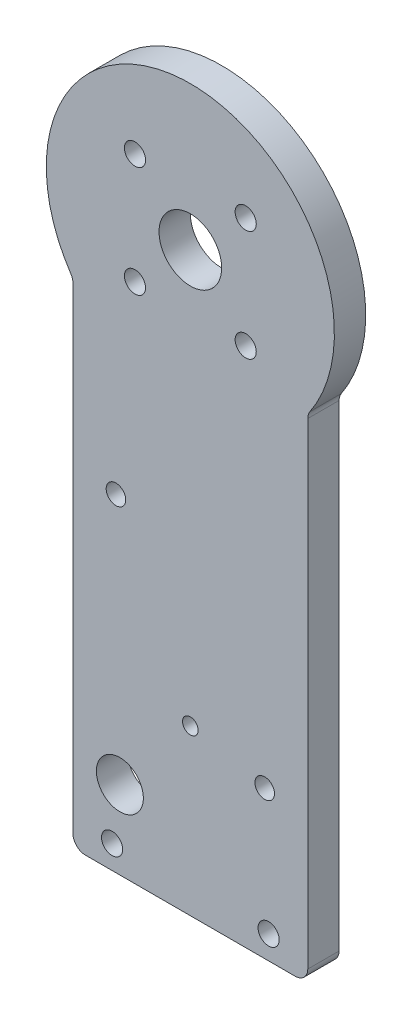
ISO-10303-21;
HEADER;
FILE_DESCRIPTION(('STEP AP214'),'2;1');
FILE_NAME('part.step','',(''),(''),'','','');
FILE_SCHEMA(('AUTOMOTIVE_DESIGN { 1 0 10303 214 1 1 1 1 }'));
ENDSEC;
DATA;
#1=APPLICATION_CONTEXT('core data for automotive mechanical design processes');
#2=APPLICATION_PROTOCOL_DEFINITION('international standard','automotive_design',2000,#1);
#3=PRODUCT_CONTEXT('',#1,'mechanical');
#4=PRODUCT('Part','Part','',(#3));
#5=PRODUCT_RELATED_PRODUCT_CATEGORY('part','',(#4));
#6=PRODUCT_DEFINITION_FORMATION('','',#4);
#7=PRODUCT_DEFINITION_CONTEXT('part definition',#1,'design');
#8=PRODUCT_DEFINITION('design','',#6,#7);
#9=PRODUCT_DEFINITION_SHAPE('','',#8);
#10=(LENGTH_UNIT() NAMED_UNIT(*) SI_UNIT(.MILLI.,.METRE.));
#11=(NAMED_UNIT(*) PLANE_ANGLE_UNIT() SI_UNIT($,.RADIAN.));
#12=(NAMED_UNIT(*) SI_UNIT($,.STERADIAN.) SOLID_ANGLE_UNIT());
#13=UNCERTAINTY_MEASURE_WITH_UNIT(LENGTH_MEASURE(1.E-05),#10,'distance_accuracy_value','');
#14=(GEOMETRIC_REPRESENTATION_CONTEXT(3) GLOBAL_UNCERTAINTY_ASSIGNED_CONTEXT((#13)) GLOBAL_UNIT_ASSIGNED_CONTEXT((#10,
#11,#12)) REPRESENTATION_CONTEXT('',''));
#15=CARTESIAN_POINT('',(0.,0.,0.));
#16=DIRECTION('',(0.,0.,1.));
#17=DIRECTION('',(1.,0.,0.));
#18=AXIS2_PLACEMENT_3D('',#15,#16,#17);
#19=CARTESIAN_POINT('',(0.,0.,4.));
#20=DIRECTION('',(0.,0.,1.));
#21=DIRECTION('',(1.,0.,0.));
#22=AXIS2_PLACEMENT_3D('',#19,#20,#21);
#23=PLANE('',#22);
#24=CARTESIAN_POINT('',(0.,-52.6564534438058,4.));
#25=DIRECTION('',(0.,0.,1.));
#26=DIRECTION('',(1.,0.,0.));
#27=AXIS2_PLACEMENT_3D('',#24,#25,#26);
#28=CIRCLE('',#27,1.);
#29=CARTESIAN_POINT('',(1.,-52.6564534438058,4.));
#30=VERTEX_POINT('',#29);
#31=EDGE_CURVE('E359',#30,#30,#28,.T.);
#32=ORIENTED_EDGE('',*,*,#31,.F.);
#33=EDGE_LOOP('',(#32));
#34=FACE_BOUND('',#33,.T.);
#35=CARTESIAN_POINT('',(-9.,-63.6564534438058,4.));
#36=DIRECTION('',(0.,0.,1.));
#37=DIRECTION('',(1.,0.,0.));
#38=AXIS2_PLACEMENT_3D('',#35,#36,#37);
#39=CIRCLE('',#38,3.);
#40=CARTESIAN_POINT('',(-5.99999999999999,-63.6564534438058,4.));
#41=VERTEX_POINT('',#40);
#42=EDGE_CURVE('E365',#41,#41,#39,.T.);
#43=ORIENTED_EDGE('',*,*,#42,.F.);
#44=EDGE_LOOP('',(#43));
#45=FACE_BOUND('',#44,.T.);
#46=CARTESIAN_POINT('',(9.5,-54.7911920736015,4.));
#47=DIRECTION('',(0.,0.,1.));
#48=DIRECTION('',(1.,0.,0.));
#49=AXIS2_PLACEMENT_3D('',#46,#47,#48);
#50=CIRCLE('',#49,1.25);
#51=CARTESIAN_POINT('',(10.75,-54.7911920736015,4.));
#52=VERTEX_POINT('',#51);
#53=EDGE_CURVE('E376',#52,#52,#50,.T.);
#54=ORIENTED_EDGE('',*,*,#53,.F.);
#55=EDGE_LOOP('',(#54));
#56=FACE_BOUND('',#55,.T.);
#57=CARTESIAN_POINT('',(-9.99999999999999,-70.6564534438058,4.));
#58=DIRECTION('',(0.,0.,1.));
#59=DIRECTION('',(1.,0.,0.));
#60=AXIS2_PLACEMENT_3D('',#57,#58,#59);
#61=CIRCLE('',#60,1.35);
#62=CARTESIAN_POINT('',(-8.64999999999999,-70.6564534438058,4.));
#63=VERTEX_POINT('',#62);
#64=EDGE_CURVE('E388',#63,#63,#61,.T.);
#65=ORIENTED_EDGE('',*,*,#64,.F.);
#66=EDGE_LOOP('',(#65));
#67=FACE_BOUND('',#66,.T.);
#68=CARTESIAN_POINT('',(7.07106781186553,7.07106781186542,4.));
#69=DIRECTION('',(0.,0.,1.));
#70=DIRECTION('',(1.,0.,0.));
#71=AXIS2_PLACEMENT_3D('',#68,#69,#70);
#72=CIRCLE('',#71,1.35);
#73=CARTESIAN_POINT('',(8.42106781186552,7.07106781186542,4.));
#74=VERTEX_POINT('',#73);
#75=EDGE_CURVE('E400',#74,#74,#72,.T.);
#76=ORIENTED_EDGE('',*,*,#75,.F.);
#77=EDGE_LOOP('',(#76));
#78=FACE_BOUND('',#77,.T.);
#79=CARTESIAN_POINT('',(0.,0.,4.));
#80=DIRECTION('',(0.,0.,1.));
#81=DIRECTION('',(1.,0.,0.));
#82=AXIS2_PLACEMENT_3D('',#79,#80,#81);
#83=CIRCLE('',#82,4.);
#84=CARTESIAN_POINT('',(4.,0.,4.));
#85=VERTEX_POINT('',#84);
#86=EDGE_CURVE('E412',#85,#85,#83,.T.);
#87=ORIENTED_EDGE('',*,*,#86,.F.);
#88=EDGE_LOOP('',(#87));
#89=FACE_BOUND('',#88,.T.);
#90=DIRECTION('',(0.,-1.,0.));
#91=VECTOR('',#90,1.);
#92=CARTESIAN_POINT('',(-15.,-10.6564534438058,4.));
#93=LINE('',#92,#91);
#94=CARTESIAN_POINT('',(-15.,-11.1552678139075,4.));
#95=VERTEX_POINT('',#94);
#96=CARTESIAN_POINT('',(-15.,-72.0564534438058,4.));
#97=VERTEX_POINT('',#96);
#98=EDGE_CURVE('E121',#95,#97,#93,.T.);
#99=ORIENTED_EDGE('',*,*,#98,.T.);
#100=CARTESIAN_POINT('',(-13.4,-72.0564534438058,4.));
#101=DIRECTION('',(0.,0.,1.));
#102=DIRECTION('',(1.,0.,0.));
#103=AXIS2_PLACEMENT_3D('',#100,#101,#102);
#104=CIRCLE('',#103,1.6);
#105=CARTESIAN_POINT('',(-13.4,-73.6564534438058,4.));
#106=VERTEX_POINT('',#105);
#107=EDGE_CURVE('E155',#97,#106,#104,.T.);
#108=ORIENTED_EDGE('',*,*,#107,.T.);
#109=DIRECTION('',(1.,0.,0.));
#110=VECTOR('',#109,1.);
#111=CARTESIAN_POINT('',(-15.,-73.6564534438058,4.));
#112=LINE('',#111,#110);
#113=CARTESIAN_POINT('',(13.4,-73.6564534438058,4.));
#114=VERTEX_POINT('',#113);
#115=EDGE_CURVE('E172',#106,#114,#112,.T.);
#116=ORIENTED_EDGE('',*,*,#115,.T.);
#117=CARTESIAN_POINT('',(13.4,-72.0564534438058,4.));
#118=DIRECTION('',(0.,0.,1.));
#119=DIRECTION('',(1.,0.,0.));
#120=AXIS2_PLACEMENT_3D('',#117,#118,#119);
#121=CIRCLE('',#120,1.6);
#122=CARTESIAN_POINT('',(15.,-72.0564534438058,4.));
#123=VERTEX_POINT('',#122);
#124=EDGE_CURVE('E57',#114,#123,#121,.T.);
#125=ORIENTED_EDGE('',*,*,#124,.T.);
#126=DIRECTION('',(0.,1.,0.));
#127=VECTOR('',#126,1.);
#128=CARTESIAN_POINT('',(15.,-10.6564534438058,4.));
#129=LINE('',#128,#127);
#130=CARTESIAN_POINT('',(15.,-11.1552678139075,4.));
#131=VERTEX_POINT('',#130);
#132=EDGE_CURVE('E141',#123,#131,#129,.T.);
#133=ORIENTED_EDGE('',*,*,#132,.T.);
#134=CARTESIAN_POINT('',(16.6,-11.1552678139075,4.));
#135=DIRECTION('',(0.,0.,1.));
#136=DIRECTION('',(1.,0.,0.));
#137=AXIS2_PLACEMENT_3D('',#134,#135,#136);
#138=CIRCLE('',#137,1.6);
#139=CARTESIAN_POINT('',(15.272,-10.2628463887949,4.));
#140=VERTEX_POINT('',#139);
#141=EDGE_CURVE('E11',#131,#140,#138,.F.);
#142=ORIENTED_EDGE('',*,*,#141,.T.);
#143=CARTESIAN_POINT('',(0.,0.,4.));
#144=DIRECTION('',(0.,0.,1.));
#145=DIRECTION('',(1.,0.,0.));
#146=AXIS2_PLACEMENT_3D('',#143,#144,#145);
#147=CIRCLE('',#146,18.4);
#148=CARTESIAN_POINT('',(-15.272,-10.2628463887949,4.));
#149=VERTEX_POINT('',#148);
#150=EDGE_CURVE('E140',#140,#149,#147,.T.);
#151=ORIENTED_EDGE('',*,*,#150,.T.);
#152=CARTESIAN_POINT('',(-16.6,-11.1552678139075,4.));
#153=DIRECTION('',(0.,0.,1.));
#154=DIRECTION('',(1.,0.,0.));
#155=AXIS2_PLACEMENT_3D('',#152,#153,#154);
#156=CIRCLE('',#155,1.6);
#157=EDGE_CURVE('E111',#149,#95,#156,.F.);
#158=ORIENTED_EDGE('',*,*,#157,.T.);
#159=EDGE_LOOP('',(#99,#108,#116,#125,#133,#142,#151,#158));
#160=FACE_BOUND('',#159,.T.);
#161=CARTESIAN_POINT('',(-7.07106781186547,-7.07106781186547,4.));
#162=DIRECTION('',(0.,0.,1.));
#163=DIRECTION('',(1.,0.,0.));
#164=AXIS2_PLACEMENT_3D('',#161,#162,#163);
#165=CIRCLE('',#164,1.35);
#166=CARTESIAN_POINT('',(-5.72106781186547,-7.07106781186547,4.));
#167=VERTEX_POINT('',#166);
#168=EDGE_CURVE('E135',#167,#167,#165,.T.);
#169=ORIENTED_EDGE('',*,*,#168,.F.);
#170=EDGE_LOOP('',(#169));
#171=FACE_BOUND('',#170,.T.);
#172=CARTESIAN_POINT('',(-7.07106781186545,7.0710678118655,4.));
#173=DIRECTION('',(0.,0.,1.));
#174=DIRECTION('',(1.,0.,0.));
#175=AXIS2_PLACEMENT_3D('',#172,#173,#174);
#176=CIRCLE('',#175,1.35);
#177=CARTESIAN_POINT('',(-5.72106781186545,7.0710678118655,4.));
#178=VERTEX_POINT('',#177);
#179=EDGE_CURVE('E406',#178,#178,#176,.T.);
#180=ORIENTED_EDGE('',*,*,#179,.F.);
#181=EDGE_LOOP('',(#180));
#182=FACE_BOUND('',#181,.T.);
#183=CARTESIAN_POINT('',(7.0710678118654,-7.07106781186555,4.));
#184=DIRECTION('',(0.,0.,1.));
#185=DIRECTION('',(1.,0.,0.));
#186=AXIS2_PLACEMENT_3D('',#183,#184,#185);
#187=CIRCLE('',#186,1.35);
#188=CARTESIAN_POINT('',(8.4210678118654,-7.07106781186555,4.));
#189=VERTEX_POINT('',#188);
#190=EDGE_CURVE('E394',#189,#189,#187,.T.);
#191=ORIENTED_EDGE('',*,*,#190,.F.);
#192=EDGE_LOOP('',(#191));
#193=FACE_BOUND('',#192,.T.);
#194=CARTESIAN_POINT('',(10.,-70.6564534438058,4.));
#195=DIRECTION('',(0.,0.,1.));
#196=DIRECTION('',(-1.,0.,0.));
#197=AXIS2_PLACEMENT_3D('',#194,#195,#196);
#198=CIRCLE('',#197,1.35);
#199=CARTESIAN_POINT('',(8.65000000000001,-70.6564534438058,4.));
#200=VERTEX_POINT('',#199);
#201=EDGE_CURVE('E382',#200,#200,#198,.T.);
#202=ORIENTED_EDGE('',*,*,#201,.F.);
#203=EDGE_LOOP('',(#202));
#204=FACE_BOUND('',#203,.T.);
#205=CARTESIAN_POINT('',(-9.50000000000001,-31.7911920736015,4.));
#206=DIRECTION('',(0.,0.,1.));
#207=DIRECTION('',(1.,0.,0.));
#208=AXIS2_PLACEMENT_3D('',#205,#206,#207);
#209=CIRCLE('',#208,1.25);
#210=CARTESIAN_POINT('',(-8.25000000000001,-31.7911920736015,4.));
#211=VERTEX_POINT('',#210);
#212=EDGE_CURVE('E370',#211,#211,#209,.T.);
#213=ORIENTED_EDGE('',*,*,#212,.F.);
#214=EDGE_LOOP('',(#213));
#215=FACE_BOUND('',#214,.T.);
#216=ADVANCED_FACE('F35',(#34,#45,#56,#67,#78,#89,#160,#171,#182,#193,#204,#215),#23,.T.);
#217=CARTESIAN_POINT('',(0.,0.,0.));
#218=DIRECTION('',(0.,0.,1.));
#219=DIRECTION('',(1.,0.,0.));
#220=AXIS2_PLACEMENT_3D('',#217,#218,#219);
#221=PLANE('',#220);
#222=CARTESIAN_POINT('',(0.,-52.6564534438058,0.));
#223=DIRECTION('',(0.,0.,1.));
#224=DIRECTION('',(1.,0.,0.));
#225=AXIS2_PLACEMENT_3D('',#222,#223,#224);
#226=CIRCLE('',#225,1.);
#227=CARTESIAN_POINT('',(1.,-52.6564534438058,0.));
#228=VERTEX_POINT('',#227);
#229=EDGE_CURVE('E357',#228,#228,#226,.T.);
#230=ORIENTED_EDGE('',*,*,#229,.T.);
#231=EDGE_LOOP('',(#230));
#232=FACE_BOUND('',#231,.T.);
#233=CARTESIAN_POINT('',(-9.,-63.6564534438058,0.));
#234=DIRECTION('',(0.,0.,1.));
#235=DIRECTION('',(1.,0.,0.));
#236=AXIS2_PLACEMENT_3D('',#233,#234,#235);
#237=CIRCLE('',#236,3.);
#238=CARTESIAN_POINT('',(-5.99999999999999,-63.6564534438058,0.));
#239=VERTEX_POINT('',#238);
#240=EDGE_CURVE('E360',#239,#239,#237,.T.);
#241=ORIENTED_EDGE('',*,*,#240,.T.);
#242=EDGE_LOOP('',(#241));
#243=FACE_BOUND('',#242,.T.);
#244=DIRECTION('',(1.,0.,0.));
#245=VECTOR('',#244,1.);
#246=CARTESIAN_POINT('',(-15.,-73.6564534438058,0.));
#247=LINE('',#246,#245);
#248=CARTESIAN_POINT('',(-13.4,-73.6564534438058,0.));
#249=VERTEX_POINT('',#248);
#250=CARTESIAN_POINT('',(13.4,-73.6564534438058,0.));
#251=VERTEX_POINT('',#250);
#252=EDGE_CURVE('E129',#249,#251,#247,.T.);
#253=ORIENTED_EDGE('',*,*,#252,.F.);
#254=CARTESIAN_POINT('',(-13.4,-72.0564534438058,0.));
#255=DIRECTION('',(0.,0.,1.));
#256=DIRECTION('',(1.,0.,0.));
#257=AXIS2_PLACEMENT_3D('',#254,#255,#256);
#258=CIRCLE('',#257,1.6);
#259=CARTESIAN_POINT('',(-15.,-72.0564534438058,0.));
#260=VERTEX_POINT('',#259);
#261=EDGE_CURVE('E128',#249,#260,#258,.F.);
#262=ORIENTED_EDGE('',*,*,#261,.T.);
#263=DIRECTION('',(0.,-1.,0.));
#264=VECTOR('',#263,1.);
#265=CARTESIAN_POINT('',(-15.,-10.6564534438058,0.));
#266=LINE('',#265,#264);
#267=CARTESIAN_POINT('',(-15.,-11.1552678139075,0.));
#268=VERTEX_POINT('',#267);
#269=EDGE_CURVE('E118',#268,#260,#266,.T.);
#270=ORIENTED_EDGE('',*,*,#269,.F.);
#271=CARTESIAN_POINT('',(-16.6,-11.1552678139075,0.));
#272=DIRECTION('',(0.,0.,1.));
#273=DIRECTION('',(1.,0.,0.));
#274=AXIS2_PLACEMENT_3D('',#271,#272,#273);
#275=CIRCLE('',#274,1.6);
#276=CARTESIAN_POINT('',(-15.272,-10.2628463887949,0.));
#277=VERTEX_POINT('',#276);
#278=EDGE_CURVE('E101',#268,#277,#275,.T.);
#279=ORIENTED_EDGE('',*,*,#278,.T.);
#280=CARTESIAN_POINT('',(0.,0.,0.));
#281=DIRECTION('',(0.,0.,1.));
#282=DIRECTION('',(1.,0.,0.));
#283=AXIS2_PLACEMENT_3D('',#280,#281,#282);
#284=CIRCLE('',#283,18.4);
#285=CARTESIAN_POINT('',(15.272,-10.2628463887949,0.));
#286=VERTEX_POINT('',#285);
#287=EDGE_CURVE('E130',#286,#277,#284,.T.);
#288=ORIENTED_EDGE('',*,*,#287,.F.);
#289=CARTESIAN_POINT('',(16.6,-11.1552678139075,0.));
#290=DIRECTION('',(0.,0.,1.));
#291=DIRECTION('',(1.,0.,0.));
#292=AXIS2_PLACEMENT_3D('',#289,#290,#291);
#293=CIRCLE('',#292,1.6);
#294=CARTESIAN_POINT('',(15.,-11.1552678139075,0.));
#295=VERTEX_POINT('',#294);
#296=EDGE_CURVE('E43',#286,#295,#293,.T.);
#297=ORIENTED_EDGE('',*,*,#296,.T.);
#298=DIRECTION('',(0.,1.,0.));
#299=VECTOR('',#298,1.);
#300=CARTESIAN_POINT('',(15.,-10.6564534438058,0.));
#301=LINE('',#300,#299);
#302=CARTESIAN_POINT('',(15.,-72.0564534438058,0.));
#303=VERTEX_POINT('',#302);
#304=EDGE_CURVE('E133',#303,#295,#301,.T.);
#305=ORIENTED_EDGE('',*,*,#304,.F.);
#306=CARTESIAN_POINT('',(13.4,-72.0564534438058,0.));
#307=DIRECTION('',(0.,0.,1.));
#308=DIRECTION('',(1.,0.,0.));
#309=AXIS2_PLACEMENT_3D('',#306,#307,#308);
#310=CIRCLE('',#309,1.6);
#311=EDGE_CURVE('E151',#303,#251,#310,.F.);
#312=ORIENTED_EDGE('',*,*,#311,.T.);
#313=EDGE_LOOP('',(#253,#262,#270,#279,#288,#297,#305,#312));
#314=FACE_BOUND('',#313,.T.);
#315=CARTESIAN_POINT('',(-7.07106781186547,-7.07106781186547,0.));
#316=DIRECTION('',(0.,0.,1.));
#317=DIRECTION('',(1.,0.,0.));
#318=AXIS2_PLACEMENT_3D('',#315,#316,#317);
#319=CIRCLE('',#318,1.35);
#320=CARTESIAN_POINT('',(-5.72106781186547,-7.07106781186547,0.));
#321=VERTEX_POINT('',#320);
#322=EDGE_CURVE('E175',#321,#321,#319,.T.);
#323=ORIENTED_EDGE('',*,*,#322,.T.);
#324=EDGE_LOOP('',(#323));
#325=FACE_BOUND('',#324,.T.);
#326=CARTESIAN_POINT('',(0.,0.,0.));
#327=DIRECTION('',(0.,0.,1.));
#328=DIRECTION('',(1.,0.,0.));
#329=AXIS2_PLACEMENT_3D('',#326,#327,#328);
#330=CIRCLE('',#329,4.);
#331=CARTESIAN_POINT('',(4.,0.,0.));
#332=VERTEX_POINT('',#331);
#333=EDGE_CURVE('E409',#332,#332,#330,.T.);
#334=ORIENTED_EDGE('',*,*,#333,.T.);
#335=EDGE_LOOP('',(#334));
#336=FACE_BOUND('',#335,.T.);
#337=CARTESIAN_POINT('',(-7.07106781186545,7.0710678118655,0.));
#338=DIRECTION('',(0.,0.,1.));
#339=DIRECTION('',(1.,0.,0.));
#340=AXIS2_PLACEMENT_3D('',#337,#338,#339);
#341=CIRCLE('',#340,1.35);
#342=CARTESIAN_POINT('',(-5.72106781186545,7.0710678118655,0.));
#343=VERTEX_POINT('',#342);
#344=EDGE_CURVE('E403',#343,#343,#341,.T.);
#345=ORIENTED_EDGE('',*,*,#344,.T.);
#346=EDGE_LOOP('',(#345));
#347=FACE_BOUND('',#346,.T.);
#348=CARTESIAN_POINT('',(7.07106781186553,7.07106781186542,0.));
#349=DIRECTION('',(0.,0.,1.));
#350=DIRECTION('',(1.,0.,0.));
#351=AXIS2_PLACEMENT_3D('',#348,#349,#350);
#352=CIRCLE('',#351,1.35);
#353=CARTESIAN_POINT('',(8.42106781186552,7.07106781186542,0.));
#354=VERTEX_POINT('',#353);
#355=EDGE_CURVE('E397',#354,#354,#352,.T.);
#356=ORIENTED_EDGE('',*,*,#355,.T.);
#357=EDGE_LOOP('',(#356));
#358=FACE_BOUND('',#357,.T.);
#359=CARTESIAN_POINT('',(7.0710678118654,-7.07106781186555,0.));
#360=DIRECTION('',(0.,0.,1.));
#361=DIRECTION('',(1.,0.,0.));
#362=AXIS2_PLACEMENT_3D('',#359,#360,#361);
#363=CIRCLE('',#362,1.35);
#364=CARTESIAN_POINT('',(8.4210678118654,-7.07106781186555,0.));
#365=VERTEX_POINT('',#364);
#366=EDGE_CURVE('E391',#365,#365,#363,.T.);
#367=ORIENTED_EDGE('',*,*,#366,.T.);
#368=EDGE_LOOP('',(#367));
#369=FACE_BOUND('',#368,.T.);
#370=CARTESIAN_POINT('',(-9.99999999999999,-70.6564534438058,0.));
#371=DIRECTION('',(0.,0.,1.));
#372=DIRECTION('',(1.,0.,0.));
#373=AXIS2_PLACEMENT_3D('',#370,#371,#372);
#374=CIRCLE('',#373,1.35);
#375=CARTESIAN_POINT('',(-8.64999999999999,-70.6564534438058,0.));
#376=VERTEX_POINT('',#375);
#377=EDGE_CURVE('E385',#376,#376,#374,.T.);
#378=ORIENTED_EDGE('',*,*,#377,.T.);
#379=EDGE_LOOP('',(#378));
#380=FACE_BOUND('',#379,.T.);
#381=CARTESIAN_POINT('',(10.,-70.6564534438058,0.));
#382=DIRECTION('',(0.,0.,1.));
#383=DIRECTION('',(-1.,0.,0.));
#384=AXIS2_PLACEMENT_3D('',#381,#382,#383);
#385=CIRCLE('',#384,1.35);
#386=CARTESIAN_POINT('',(8.65000000000001,-70.6564534438058,0.));
#387=VERTEX_POINT('',#386);
#388=EDGE_CURVE('E379',#387,#387,#385,.T.);
#389=ORIENTED_EDGE('',*,*,#388,.T.);
#390=EDGE_LOOP('',(#389));
#391=FACE_BOUND('',#390,.T.);
#392=CARTESIAN_POINT('',(9.5,-54.7911920736015,0.));
#393=DIRECTION('',(0.,0.,1.));
#394=DIRECTION('',(1.,0.,0.));
#395=AXIS2_PLACEMENT_3D('',#392,#393,#394);
#396=CIRCLE('',#395,1.25);
#397=CARTESIAN_POINT('',(10.75,-54.7911920736015,0.));
#398=VERTEX_POINT('',#397);
#399=EDGE_CURVE('E373',#398,#398,#396,.T.);
#400=ORIENTED_EDGE('',*,*,#399,.T.);
#401=EDGE_LOOP('',(#400));
#402=FACE_BOUND('',#401,.T.);
#403=CARTESIAN_POINT('',(-9.50000000000001,-31.7911920736015,0.));
#404=DIRECTION('',(0.,0.,1.));
#405=DIRECTION('',(1.,0.,0.));
#406=AXIS2_PLACEMENT_3D('',#403,#404,#405);
#407=CIRCLE('',#406,1.25);
#408=CARTESIAN_POINT('',(-8.25000000000001,-31.7911920736015,0.));
#409=VERTEX_POINT('',#408);
#410=EDGE_CURVE('E362',#409,#409,#407,.T.);
#411=ORIENTED_EDGE('',*,*,#410,.T.);
#412=EDGE_LOOP('',(#411));
#413=FACE_BOUND('',#412,.T.);
#414=ADVANCED_FACE('F126',(#232,#243,#314,#325,#336,#347,#358,#369,#380,#391,#402,#413),#221,.F.);
#415=CARTESIAN_POINT('',(0.,0.,4.));
#416=DIRECTION('',(0.,0.,-1.));
#417=DIRECTION('',(-1.,0.,0.));
#418=AXIS2_PLACEMENT_3D('',#415,#416,#417);
#419=CYLINDRICAL_SURFACE('',#418,18.4);
#420=ORIENTED_EDGE('',*,*,#287,.T.);
#421=DIRECTION('',(0.,0.,-1.));
#422=VECTOR('',#421,1.);
#423=CARTESIAN_POINT('',(-15.272,-10.2628463887949,4.));
#424=LINE('',#423,#422);
#425=EDGE_CURVE('E106',#277,#149,#424,.F.);
#426=ORIENTED_EDGE('',*,*,#425,.T.);
#427=ORIENTED_EDGE('',*,*,#150,.F.);
#428=DIRECTION('',(0.,0.,-1.));
#429=VECTOR('',#428,1.);
#430=CARTESIAN_POINT('',(15.272,-10.2628463887949,4.));
#431=LINE('',#430,#429);
#432=EDGE_CURVE('E122',#140,#286,#431,.T.);
#433=ORIENTED_EDGE('',*,*,#432,.T.);
#434=EDGE_LOOP('',(#420,#426,#427,#433));
#435=FACE_BOUND('',#434,.T.);
#436=ADVANCED_FACE('F170',(#435),#419,.T.);
#437=CARTESIAN_POINT('',(-15.,-10.6564534438058,4.));
#438=DIRECTION('',(1.,0.,0.));
#439=DIRECTION('',(0.,1.,0.));
#440=AXIS2_PLACEMENT_3D('',#437,#438,#439);
#441=PLANE('',#440);
#442=ORIENTED_EDGE('',*,*,#98,.F.);
#443=DIRECTION('',(0.,0.,1.));
#444=VECTOR('',#443,1.);
#445=CARTESIAN_POINT('',(-15.,-11.1552678139075,0.));
#446=LINE('',#445,#444);
#447=EDGE_CURVE('E105',#95,#268,#446,.F.);
#448=ORIENTED_EDGE('',*,*,#447,.T.);
#449=ORIENTED_EDGE('',*,*,#269,.T.);
#450=DIRECTION('',(0.,0.,-1.));
#451=VECTOR('',#450,1.);
#452=CARTESIAN_POINT('',(-15.,-72.0564534438058,4.));
#453=LINE('',#452,#451);
#454=EDGE_CURVE('E123',#260,#97,#453,.F.);
#455=ORIENTED_EDGE('',*,*,#454,.T.);
#456=EDGE_LOOP('',(#442,#448,#449,#455));
#457=FACE_BOUND('',#456,.T.);
#458=ADVANCED_FACE('F117',(#457),#441,.F.);
#459=CARTESIAN_POINT('',(-15.,-73.6564534438058,4.));
#460=DIRECTION('',(0.,1.,0.));
#461=DIRECTION('',(0.,0.,1.));
#462=AXIS2_PLACEMENT_3D('',#459,#460,#461);
#463=PLANE('',#462);
#464=ORIENTED_EDGE('',*,*,#115,.F.);
#465=DIRECTION('',(0.,0.,-1.));
#466=VECTOR('',#465,1.);
#467=CARTESIAN_POINT('',(-13.4,-73.6564534438058,4.));
#468=LINE('',#467,#466);
#469=EDGE_CURVE('E148',#106,#249,#468,.T.);
#470=ORIENTED_EDGE('',*,*,#469,.T.);
#471=ORIENTED_EDGE('',*,*,#252,.T.);
#472=DIRECTION('',(0.,0.,-1.));
#473=VECTOR('',#472,1.);
#474=CARTESIAN_POINT('',(13.4,-73.6564534438058,4.));
#475=LINE('',#474,#473);
#476=EDGE_CURVE('E146',#251,#114,#475,.F.);
#477=ORIENTED_EDGE('',*,*,#476,.T.);
#478=EDGE_LOOP('',(#464,#470,#471,#477));
#479=FACE_BOUND('',#478,.T.);
#480=ADVANCED_FACE('F185',(#479),#463,.F.);
#481=CARTESIAN_POINT('',(15.,-10.6564534438058,4.));
#482=DIRECTION('',(-1.,0.,0.));
#483=DIRECTION('',(0.,-1.,0.));
#484=AXIS2_PLACEMENT_3D('',#481,#482,#483);
#485=PLANE('',#484);
#486=ORIENTED_EDGE('',*,*,#132,.F.);
#487=DIRECTION('',(0.,0.,-1.));
#488=VECTOR('',#487,1.);
#489=CARTESIAN_POINT('',(15.,-72.0564534438058,4.));
#490=LINE('',#489,#488);
#491=EDGE_CURVE('E112',#123,#303,#490,.T.);
#492=ORIENTED_EDGE('',*,*,#491,.T.);
#493=ORIENTED_EDGE('',*,*,#304,.T.);
#494=DIRECTION('',(0.,0.,1.));
#495=VECTOR('',#494,1.);
#496=CARTESIAN_POINT('',(15.,-11.1552678139075,4.));
#497=LINE('',#496,#495);
#498=EDGE_CURVE('E50',#295,#131,#497,.T.);
#499=ORIENTED_EDGE('',*,*,#498,.T.);
#500=EDGE_LOOP('',(#486,#492,#493,#499));
#501=FACE_BOUND('',#500,.T.);
#502=ADVANCED_FACE('F163',(#501),#485,.F.);
#503=CARTESIAN_POINT('',(-7.07106781186547,-7.07106781186547,4.));
#504=DIRECTION('',(0.,0.,-1.));
#505=DIRECTION('',(-1.,0.,0.));
#506=AXIS2_PLACEMENT_3D('',#503,#504,#505);
#507=CYLINDRICAL_SURFACE('',#506,1.35);
#508=ORIENTED_EDGE('',*,*,#168,.T.);
#509=EDGE_LOOP('',(#508));
#510=FACE_BOUND('',#509,.T.);
#511=ORIENTED_EDGE('',*,*,#322,.F.);
#512=EDGE_LOOP('',(#511));
#513=FACE_BOUND('',#512,.T.);
#514=ADVANCED_FACE('F207',(#510,#513),#507,.F.);
#515=CARTESIAN_POINT('',(0.,0.,4.));
#516=DIRECTION('',(0.,0.,-1.));
#517=DIRECTION('',(-1.,0.,0.));
#518=AXIS2_PLACEMENT_3D('',#515,#516,#517);
#519=CYLINDRICAL_SURFACE('',#518,4.);
#520=ORIENTED_EDGE('',*,*,#86,.T.);
#521=EDGE_LOOP('',(#520));
#522=FACE_BOUND('',#521,.T.);
#523=ORIENTED_EDGE('',*,*,#333,.F.);
#524=EDGE_LOOP('',(#523));
#525=FACE_BOUND('',#524,.T.);
#526=ADVANCED_FACE('F241',(#522,#525),#519,.F.);
#527=CARTESIAN_POINT('',(-7.07106781186545,7.0710678118655,4.));
#528=DIRECTION('',(0.,0.,-1.));
#529=DIRECTION('',(-1.,0.,0.));
#530=AXIS2_PLACEMENT_3D('',#527,#528,#529);
#531=CYLINDRICAL_SURFACE('',#530,1.35);
#532=ORIENTED_EDGE('',*,*,#179,.T.);
#533=EDGE_LOOP('',(#532));
#534=FACE_BOUND('',#533,.T.);
#535=ORIENTED_EDGE('',*,*,#344,.F.);
#536=EDGE_LOOP('',(#535));
#537=FACE_BOUND('',#536,.T.);
#538=ADVANCED_FACE('F248',(#534,#537),#531,.F.);
#539=CARTESIAN_POINT('',(7.07106781186553,7.07106781186542,4.));
#540=DIRECTION('',(0.,0.,-1.));
#541=DIRECTION('',(-1.,0.,0.));
#542=AXIS2_PLACEMENT_3D('',#539,#540,#541);
#543=CYLINDRICAL_SURFACE('',#542,1.35);
#544=ORIENTED_EDGE('',*,*,#75,.T.);
#545=EDGE_LOOP('',(#544));
#546=FACE_BOUND('',#545,.T.);
#547=ORIENTED_EDGE('',*,*,#355,.F.);
#548=EDGE_LOOP('',(#547));
#549=FACE_BOUND('',#548,.T.);
#550=ADVANCED_FACE('F255',(#546,#549),#543,.F.);
#551=CARTESIAN_POINT('',(7.0710678118654,-7.07106781186555,4.));
#552=DIRECTION('',(0.,0.,-1.));
#553=DIRECTION('',(-1.,0.,0.));
#554=AXIS2_PLACEMENT_3D('',#551,#552,#553);
#555=CYLINDRICAL_SURFACE('',#554,1.35);
#556=ORIENTED_EDGE('',*,*,#190,.T.);
#557=EDGE_LOOP('',(#556));
#558=FACE_BOUND('',#557,.T.);
#559=ORIENTED_EDGE('',*,*,#366,.F.);
#560=EDGE_LOOP('',(#559));
#561=FACE_BOUND('',#560,.T.);
#562=ADVANCED_FACE('F263',(#558,#561),#555,.F.);
#563=CARTESIAN_POINT('',(-9.99999999999999,-70.6564534438058,4.));
#564=DIRECTION('',(0.,0.,-1.));
#565=DIRECTION('',(-1.,0.,0.));
#566=AXIS2_PLACEMENT_3D('',#563,#564,#565);
#567=CYLINDRICAL_SURFACE('',#566,1.35);
#568=ORIENTED_EDGE('',*,*,#64,.T.);
#569=EDGE_LOOP('',(#568));
#570=FACE_BOUND('',#569,.T.);
#571=ORIENTED_EDGE('',*,*,#377,.F.);
#572=EDGE_LOOP('',(#571));
#573=FACE_BOUND('',#572,.T.);
#574=ADVANCED_FACE('F271',(#570,#573),#567,.F.);
#575=CARTESIAN_POINT('',(10.,-70.6564534438058,4.));
#576=DIRECTION('',(0.,0.,-1.));
#577=DIRECTION('',(-1.,0.,0.));
#578=AXIS2_PLACEMENT_3D('',#575,#576,#577);
#579=CYLINDRICAL_SURFACE('',#578,1.35);
#580=ORIENTED_EDGE('',*,*,#201,.T.);
#581=EDGE_LOOP('',(#580));
#582=FACE_BOUND('',#581,.T.);
#583=ORIENTED_EDGE('',*,*,#388,.F.);
#584=EDGE_LOOP('',(#583));
#585=FACE_BOUND('',#584,.T.);
#586=ADVANCED_FACE('F279',(#582,#585),#579,.F.);
#587=CARTESIAN_POINT('',(9.5,-54.7911920736015,4.));
#588=DIRECTION('',(0.,0.,-1.));
#589=DIRECTION('',(-1.,0.,0.));
#590=AXIS2_PLACEMENT_3D('',#587,#588,#589);
#591=CYLINDRICAL_SURFACE('',#590,1.25);
#592=ORIENTED_EDGE('',*,*,#53,.T.);
#593=EDGE_LOOP('',(#592));
#594=FACE_BOUND('',#593,.T.);
#595=ORIENTED_EDGE('',*,*,#399,.F.);
#596=EDGE_LOOP('',(#595));
#597=FACE_BOUND('',#596,.T.);
#598=ADVANCED_FACE('F287',(#594,#597),#591,.F.);
#599=CARTESIAN_POINT('',(-9.50000000000001,-31.7911920736015,4.));
#600=DIRECTION('',(0.,0.,-1.));
#601=DIRECTION('',(-1.,0.,0.));
#602=AXIS2_PLACEMENT_3D('',#599,#600,#601);
#603=CYLINDRICAL_SURFACE('',#602,1.25);
#604=ORIENTED_EDGE('',*,*,#212,.T.);
#605=EDGE_LOOP('',(#604));
#606=FACE_BOUND('',#605,.T.);
#607=ORIENTED_EDGE('',*,*,#410,.F.);
#608=EDGE_LOOP('',(#607));
#609=FACE_BOUND('',#608,.T.);
#610=ADVANCED_FACE('F194',(#606,#609),#603,.F.);
#611=CARTESIAN_POINT('',(-16.6,-11.1552678139075,4.));
#612=DIRECTION('',(0.,0.,-1.));
#613=DIRECTION('',(-1.,0.,0.));
#614=AXIS2_PLACEMENT_3D('',#611,#612,#613);
#615=CYLINDRICAL_SURFACE('',#614,1.6);
#616=ORIENTED_EDGE('',*,*,#157,.F.);
#617=ORIENTED_EDGE('',*,*,#425,.F.);
#618=ORIENTED_EDGE('',*,*,#278,.F.);
#619=ORIENTED_EDGE('',*,*,#447,.F.);
#620=EDGE_LOOP('',(#616,#617,#618,#619));
#621=FACE_BOUND('',#620,.T.);
#622=ADVANCED_FACE('F104',(#621),#615,.F.);
#623=CARTESIAN_POINT('',(-13.4,-72.0564534438058,4.));
#624=DIRECTION('',(0.,0.,-1.));
#625=DIRECTION('',(-1.,0.,0.));
#626=AXIS2_PLACEMENT_3D('',#623,#624,#625);
#627=CYLINDRICAL_SURFACE('',#626,1.6);
#628=ORIENTED_EDGE('',*,*,#107,.F.);
#629=ORIENTED_EDGE('',*,*,#454,.F.);
#630=ORIENTED_EDGE('',*,*,#261,.F.);
#631=ORIENTED_EDGE('',*,*,#469,.F.);
#632=EDGE_LOOP('',(#628,#629,#630,#631));
#633=FACE_BOUND('',#632,.T.);
#634=ADVANCED_FACE('F187',(#633),#627,.T.);
#635=CARTESIAN_POINT('',(13.4,-72.0564534438058,4.));
#636=DIRECTION('',(0.,0.,-1.));
#637=DIRECTION('',(-1.,0.,0.));
#638=AXIS2_PLACEMENT_3D('',#635,#636,#637);
#639=CYLINDRICAL_SURFACE('',#638,1.6);
#640=ORIENTED_EDGE('',*,*,#124,.F.);
#641=ORIENTED_EDGE('',*,*,#476,.F.);
#642=ORIENTED_EDGE('',*,*,#311,.F.);
#643=ORIENTED_EDGE('',*,*,#491,.F.);
#644=EDGE_LOOP('',(#640,#641,#642,#643));
#645=FACE_BOUND('',#644,.T.);
#646=ADVANCED_FACE('F184',(#645),#639,.T.);
#647=CARTESIAN_POINT('',(16.6,-11.1552678139075,4.));
#648=DIRECTION('',(0.,0.,-1.));
#649=DIRECTION('',(-1.,0.,0.));
#650=AXIS2_PLACEMENT_3D('',#647,#648,#649);
#651=CYLINDRICAL_SURFACE('',#650,1.6);
#652=ORIENTED_EDGE('',*,*,#141,.F.);
#653=ORIENTED_EDGE('',*,*,#498,.F.);
#654=ORIENTED_EDGE('',*,*,#296,.F.);
#655=ORIENTED_EDGE('',*,*,#432,.F.);
#656=EDGE_LOOP('',(#652,#653,#654,#655));
#657=FACE_BOUND('',#656,.T.);
#658=ADVANCED_FACE('F37',(#657),#651,.F.);
#659=CARTESIAN_POINT('',(-9.,-63.6564534438058,0.));
#660=DIRECTION('',(0.,0.,1.));
#661=DIRECTION('',(1.,0.,0.));
#662=AXIS2_PLACEMENT_3D('',#659,#660,#661);
#663=CYLINDRICAL_SURFACE('',#662,3.);
#664=ORIENTED_EDGE('',*,*,#240,.F.);
#665=EDGE_LOOP('',(#664));
#666=FACE_BOUND('',#665,.T.);
#667=ORIENTED_EDGE('',*,*,#42,.T.);
#668=EDGE_LOOP('',(#667));
#669=FACE_BOUND('',#668,.T.);
#670=ADVANCED_FACE('F323',(#666,#669),#663,.F.);
#671=CARTESIAN_POINT('',(0.,-52.6564534438058,0.));
#672=DIRECTION('',(0.,0.,1.));
#673=DIRECTION('',(1.,0.,0.));
#674=AXIS2_PLACEMENT_3D('',#671,#672,#673);
#675=CYLINDRICAL_SURFACE('',#674,1.);
#676=ORIENTED_EDGE('',*,*,#229,.F.);
#677=EDGE_LOOP('',(#676));
#678=FACE_BOUND('',#677,.T.);
#679=ORIENTED_EDGE('',*,*,#31,.T.);
#680=EDGE_LOOP('',(#679));
#681=FACE_BOUND('',#680,.T.);
#682=ADVANCED_FACE('F340',(#678,#681),#675,.F.);
#683=CLOSED_SHELL('',(#216,#414,#436,#458,#480,#502,#514,#526,#538,#550,#562,#574,#586,#598,
#610,#622,#634,#646,#658,#670,#682));
#684=MANIFOLD_SOLID_BREP('B2',#683);
#685=ADVANCED_BREP_SHAPE_REPRESENTATION('',(#18,#684),#14);
#686=SHAPE_DEFINITION_REPRESENTATION(#9,#685);
ENDSEC;
END-ISO-10303-21;
